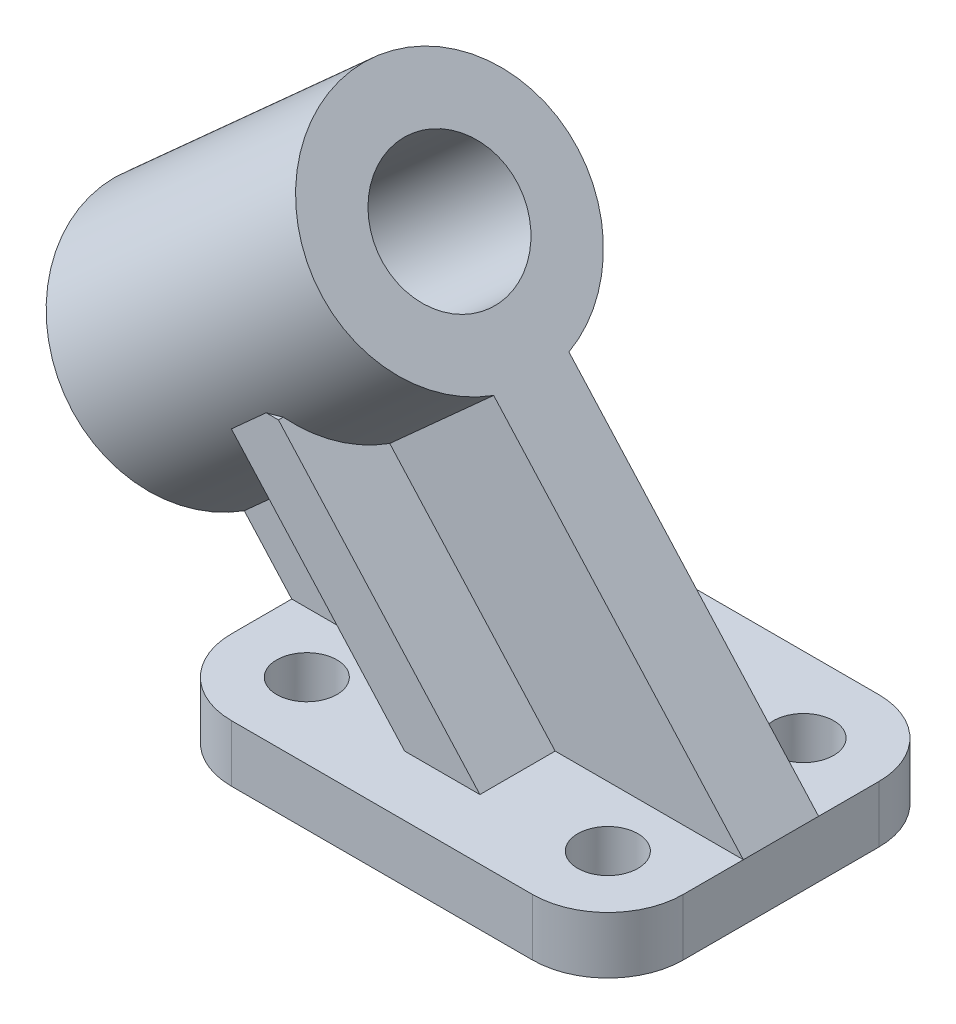
ISO-10303-21;
HEADER;
FILE_DESCRIPTION(('STEP AP214'),'2;1');
FILE_NAME('part.step','',(''),(''),'','','');
FILE_SCHEMA(('AUTOMOTIVE_DESIGN { 1 0 10303 214 1 1 1 1 }'));
ENDSEC;
DATA;
#1=APPLICATION_CONTEXT('core data for automotive mechanical design processes');
#2=APPLICATION_PROTOCOL_DEFINITION('international standard','automotive_design',2000,#1);
#3=PRODUCT_CONTEXT('',#1,'mechanical');
#4=PRODUCT('Part','Part','',(#3));
#5=PRODUCT_RELATED_PRODUCT_CATEGORY('part','',(#4));
#6=PRODUCT_DEFINITION_FORMATION('','',#4);
#7=PRODUCT_DEFINITION_CONTEXT('part definition',#1,'design');
#8=PRODUCT_DEFINITION('design','',#6,#7);
#9=PRODUCT_DEFINITION_SHAPE('','',#8);
#10=(LENGTH_UNIT() NAMED_UNIT(*) SI_UNIT(.MILLI.,.METRE.));
#11=(NAMED_UNIT(*) PLANE_ANGLE_UNIT() SI_UNIT($,.RADIAN.));
#12=(NAMED_UNIT(*) SI_UNIT($,.STERADIAN.) SOLID_ANGLE_UNIT());
#13=UNCERTAINTY_MEASURE_WITH_UNIT(LENGTH_MEASURE(1.E-05),#10,'distance_accuracy_value','');
#14=(GEOMETRIC_REPRESENTATION_CONTEXT(3) GLOBAL_UNCERTAINTY_ASSIGNED_CONTEXT((#13)) GLOBAL_UNIT_ASSIGNED_CONTEXT((#10,
#11,#12)) REPRESENTATION_CONTEXT('',''));
#15=CARTESIAN_POINT('',(0.,0.,0.));
#16=DIRECTION('',(0.,0.,1.));
#17=DIRECTION('',(1.,0.,0.));
#18=AXIS2_PLACEMENT_3D('',#15,#16,#17);
#19=CARTESIAN_POINT('',(17.1756411930332,55.1112688305533,-28.));
#20=DIRECTION('',(-0.743144825477396,-0.669130606358856,0.));
#21=DIRECTION('',(0.669130606358856,-0.743144825477396,0.));
#22=AXIS2_PLACEMENT_3D('',#19,#20,#21);
#23=PLANE('',#22);
#24=DIRECTION('',(0.669130606358856,-0.743144825477396,0.));
#25=VECTOR('',#24,1.);
#26=CARTESIAN_POINT('',(17.1756411930332,55.1112688305533,-28.));
#27=LINE('',#26,#25);
#28=CARTESIAN_POINT('',(26.8294373587605,44.3896419932865,-28.));
#29=VERTEX_POINT('',#28);
#30=CARTESIAN_POINT('',(60.,7.55,-28.));
#31=VERTEX_POINT('',#30);
#32=EDGE_CURVE('E334',#29,#31,#27,.T.);
#33=ORIENTED_EDGE('',*,*,#32,.F.);
#34=CARTESIAN_POINT('',(15.9573518712071,56.4643161980562,-23.));
#35=DIRECTION('',(0.743144825477396,0.669130606358857,0.));
#36=DIRECTION('',(-0.669130606358857,0.743144825477396,0.));
#37=AXIS2_PLACEMENT_3D('',#34,#35,#36);
#38=CIRCLE('',#37,17.);
#39=CARTESIAN_POINT('',(26.8294373587605,44.3896419932865,-18.));
#40=VERTEX_POINT('',#39);
#41=EDGE_CURVE('E293',#29,#40,#38,.T.);
#42=ORIENTED_EDGE('',*,*,#41,.T.);
#43=DIRECTION('',(0.669130606358856,-0.743144825477396,0.));
#44=VECTOR('',#43,1.);
#45=CARTESIAN_POINT('',(17.1756411930332,55.1112688305533,-18.));
#46=LINE('',#45,#44);
#47=CARTESIAN_POINT('',(60.,7.55,-18.));
#48=VERTEX_POINT('',#47);
#49=EDGE_CURVE('E323',#40,#48,#46,.T.);
#50=ORIENTED_EDGE('',*,*,#49,.T.);
#51=DIRECTION('',(0.,0.,-1.));
#52=VECTOR('',#51,1.);
#53=CARTESIAN_POINT('',(60.,7.55,-28.));
#54=LINE('',#53,#52);
#55=EDGE_CURVE('E306',#48,#31,#54,.T.);
#56=ORIENTED_EDGE('',*,*,#55,.T.);
#57=EDGE_LOOP('',(#33,#42,#50,#56));
#58=FACE_BOUND('',#57,.T.);
#59=CARTESIAN_POINT('',(15.957351871207,56.4643161980562,-23.));
#60=DIRECTION('',(0.743144825477396,0.669130606358856,0.));
#61=DIRECTION('',(-0.669130606358856,0.743144825477396,0.));
#62=AXIS2_PLACEMENT_3D('',#59,#60,#61);
#63=CIRCLE('',#62,9.);
#64=CARTESIAN_POINT('',(9.93517641397734,63.1526196273528,-23.));
#65=VERTEX_POINT('',#64);
#66=EDGE_CURVE('E854',#65,#65,#63,.T.);
#67=ORIENTED_EDGE('',*,*,#66,.F.);
#68=EDGE_LOOP('',(#67));
#69=FACE_BOUND('',#68,.T.);
#70=ADVANCED_FACE('F65',(#58,#69),#23,.F.);
#71=CARTESIAN_POINT('',(-17.1785020268227,26.628659337008,-23.));
#72=DIRECTION('',(0.743144825477396,0.669130606358857,0.));
#73=DIRECTION('',(-0.669130606358857,0.743144825477396,0.));
#74=AXIS2_PLACEMENT_3D('',#71,#72,#73);
#75=CYLINDRICAL_SURFACE('',#74,17.);
#76=CARTESIAN_POINT('',(-5.35366211243645,37.2757930190959,-23.));
#77=DIRECTION('',(0.,-1.,0.));
#78=DIRECTION('',(1.,0.,0.));
#79=AXIS2_PLACEMENT_3D('',#76,#77,#78);
#80=ELLIPSE('',#79,25.4061013476984,17.);
#81=CARTESIAN_POINT('',(6.60215028648047,37.2757930190959,-8.));
#82=VERTEX_POINT('',#81);
#83=CARTESIAN_POINT('',(8.23477574564576,37.2757930190959,-8.63589400740324));
#84=VERTEX_POINT('',#83);
#85=EDGE_CURVE('E12',#82,#84,#80,.F.);
#86=ORIENTED_EDGE('',*,*,#85,.T.);
#87=CARTESIAN_POINT('',(2.15074608036136,44.0327925059528,-23.));
#88=DIRECTION('',(-0.743144825477396,-0.669130606358856,0.));
#89=DIRECTION('',(0.669130606358856,-0.743144825477396,0.));
#90=AXIS2_PLACEMENT_3D('',#87,#88,#89);
#91=CIRCLE('',#90,17.);
#92=CARTESIAN_POINT('',(13.0228315679147,31.9581183011831,-18.));
#93=VERTEX_POINT('',#92);
#94=EDGE_CURVE('E234',#84,#93,#91,.F.);
#95=ORIENTED_EDGE('',*,*,#94,.T.);
#96=DIRECTION('',(0.743144825477396,0.669130606358857,0.));
#97=VECTOR('',#96,1.);
#98=CARTESIAN_POINT('',(-6.30641653926925,14.5539851322383,-18.));
#99=LINE('',#98,#97);
#100=EDGE_CURVE('E458',#40,#93,#99,.F.);
#101=ORIENTED_EDGE('',*,*,#100,.F.);
#102=ORIENTED_EDGE('',*,*,#41,.F.);
#103=DIRECTION('',(0.743144825477396,0.669130606358857,0.));
#104=VECTOR('',#103,1.);
#105=CARTESIAN_POINT('',(-6.30641653926925,14.5539851322383,-28.));
#106=LINE('',#105,#104);
#107=CARTESIAN_POINT('',(13.0228315679148,31.9581183011831,-28.));
#108=VERTEX_POINT('',#107);
#109=EDGE_CURVE('E298',#108,#29,#106,.T.);
#110=ORIENTED_EDGE('',*,*,#109,.F.);
#111=CARTESIAN_POINT('',(2.15074608036136,44.0327925059528,-23.));
#112=DIRECTION('',(-0.743144825477396,-0.669130606358856,0.));
#113=DIRECTION('',(0.669130606358856,-0.743144825477396,0.));
#114=AXIS2_PLACEMENT_3D('',#111,#112,#113);
#115=CIRCLE('',#114,17.);
#116=CARTESIAN_POINT('',(8.23477574564576,37.2757930190959,-37.3641059925967));
#117=VERTEX_POINT('',#116);
#118=EDGE_CURVE('E469',#108,#117,#115,.F.);
#119=ORIENTED_EDGE('',*,*,#118,.T.);
#120=CARTESIAN_POINT('',(-5.35366211243645,37.2757930190959,-23.));
#121=DIRECTION('',(0.,1.,0.));
#122=DIRECTION('',(1.,0.,0.));
#123=AXIS2_PLACEMENT_3D('',#120,#121,#122);
#124=ELLIPSE('',#123,25.4061013476984,17.);
#125=CARTESIAN_POINT('',(6.60215028648043,37.2757930190959,-38.));
#126=VERTEX_POINT('',#125);
#127=EDGE_CURVE('E462',#126,#117,#124,.F.);
#128=ORIENTED_EDGE('',*,*,#127,.F.);
#129=DIRECTION('',(0.743144825477396,0.669130606358857,0.));
#130=VECTOR('',#129,1.);
#131=CARTESIAN_POINT('',(-11.8254571759518,20.6835007331889,-38.));
#132=LINE('',#131,#130);
#133=CARTESIAN_POINT('',(1.9811486148939,33.1150244252923,-38.));
#134=VERTEX_POINT('',#133);
#135=EDGE_CURVE('E466',#126,#134,#132,.F.);
#136=ORIENTED_EDGE('',*,*,#135,.T.);
#137=CARTESIAN_POINT('',(-3.37189623597693,39.0601830291114,-23.));
#138=DIRECTION('',(0.743144825477396,0.669130606358856,0.));
#139=DIRECTION('',(-0.669130606358856,0.743144825477396,0.));
#140=AXIS2_PLACEMENT_3D('',#137,#138,#139);
#141=CIRCLE('',#140,17.);
#142=CARTESIAN_POINT('',(7.50018925157645,26.9855088243417,-28.));
#143=VERTEX_POINT('',#142);
#144=EDGE_CURVE('E472',#134,#143,#141,.F.);
#145=ORIENTED_EDGE('',*,*,#144,.T.);
#146=CARTESIAN_POINT('',(-6.30641653926925,14.5539851322383,-28.));
#147=VERTEX_POINT('',#146);
#148=EDGE_CURVE('E302',#147,#143,#106,.T.);
#149=ORIENTED_EDGE('',*,*,#148,.F.);
#150=CARTESIAN_POINT('',(-17.1785020268227,26.628659337008,-23.));
#151=DIRECTION('',(0.743144825477396,0.669130606358857,0.));
#152=DIRECTION('',(-0.669130606358857,0.743144825477396,0.));
#153=AXIS2_PLACEMENT_3D('',#150,#151,#152);
#154=CIRCLE('',#153,17.);
#155=CARTESIAN_POINT('',(-6.30641653926925,14.5539851322383,-18.));
#156=VERTEX_POINT('',#155);
#157=EDGE_CURVE('E294',#147,#156,#154,.T.);
#158=ORIENTED_EDGE('',*,*,#157,.T.);
#159=CARTESIAN_POINT('',(7.50018925157645,26.9855088243417,-18.));
#160=VERTEX_POINT('',#159);
#161=EDGE_CURVE('E457',#160,#156,#99,.F.);
#162=ORIENTED_EDGE('',*,*,#161,.F.);
#163=CARTESIAN_POINT('',(-3.37189623597694,39.0601830291114,-23.));
#164=DIRECTION('',(0.743144825477396,0.669130606358856,0.));
#165=DIRECTION('',(-0.669130606358856,0.743144825477396,0.));
#166=AXIS2_PLACEMENT_3D('',#163,#164,#165);
#167=CIRCLE('',#166,17.);
#168=CARTESIAN_POINT('',(1.98114861489392,33.1150244252923,-8.));
#169=VERTEX_POINT('',#168);
#170=EDGE_CURVE('E81',#160,#169,#167,.F.);
#171=ORIENTED_EDGE('',*,*,#170,.T.);
#172=DIRECTION('',(0.743144825477396,0.669130606358857,0.));
#173=VECTOR('',#172,1.);
#174=CARTESIAN_POINT('',(-11.8254571759518,20.6835007331889,-8.));
#175=LINE('',#174,#173);
#176=EDGE_CURVE('E256',#169,#82,#175,.T.);
#177=ORIENTED_EDGE('',*,*,#176,.T.);
#178=EDGE_LOOP('',(#86,#95,#101,#102,#110,#119,#128,#136,#145,#149,#158,#162,#171,#177));
#179=FACE_BOUND('',#178,.T.);
#180=ADVANCED_FACE('F496',(#179),#75,.T.);
#181=CARTESIAN_POINT('',(0.,7.55,0.));
#182=DIRECTION('',(0.,-1.,0.));
#183=DIRECTION('',(0.,0.,-1.));
#184=AXIS2_PLACEMENT_3D('',#181,#182,#183);
#185=PLANE('',#184);
#186=CARTESIAN_POINT('',(10.,7.55,-10.));
#187=DIRECTION('',(0.,1.,0.));
#188=DIRECTION('',(0.,0.,1.));
#189=AXIS2_PLACEMENT_3D('',#186,#187,#188);
#190=CIRCLE('',#189,3.99999999999999);
#191=CARTESIAN_POINT('',(10.,7.55,-6.00000000000001));
#192=VERTEX_POINT('',#191);
#193=EDGE_CURVE('E345',#192,#192,#190,.T.);
#194=ORIENTED_EDGE('',*,*,#193,.F.);
#195=EDGE_LOOP('',(#194));
#196=FACE_BOUND('',#195,.T.);
#197=CARTESIAN_POINT('',(50.,7.55,-10.));
#198=DIRECTION('',(0.,1.,0.));
#199=DIRECTION('',(0.,0.,1.));
#200=AXIS2_PLACEMENT_3D('',#197,#198,#199);
#201=CIRCLE('',#200,4.);
#202=CARTESIAN_POINT('',(50.,7.55,-6.));
#203=VERTEX_POINT('',#202);
#204=EDGE_CURVE('E337',#203,#203,#201,.T.);
#205=ORIENTED_EDGE('',*,*,#204,.F.);
#206=EDGE_LOOP('',(#205));
#207=FACE_BOUND('',#206,.T.);
#208=DIRECTION('',(0.,0.,-1.));
#209=VECTOR('',#208,1.);
#210=CARTESIAN_POINT('',(35.,7.55,-18.));
#211=LINE('',#210,#209);
#212=CARTESIAN_POINT('',(35.,7.55,-8.));
#213=VERTEX_POINT('',#212);
#214=CARTESIAN_POINT('',(35.,7.55,-18.));
#215=VERTEX_POINT('',#214);
#216=EDGE_CURVE('E244',#213,#215,#211,.T.);
#217=ORIENTED_EDGE('',*,*,#216,.F.);
#218=DIRECTION('',(1.,0.,0.));
#219=VECTOR('',#218,1.);
#220=CARTESIAN_POINT('',(35.,7.55,-8.));
#221=LINE('',#220,#219);
#222=CARTESIAN_POINT('',(25.,7.55,-8.));
#223=VERTEX_POINT('',#222);
#224=EDGE_CURVE('E226',#223,#213,#221,.T.);
#225=ORIENTED_EDGE('',*,*,#224,.F.);
#226=DIRECTION('',(0.,0.,1.));
#227=VECTOR('',#226,1.);
#228=CARTESIAN_POINT('',(25.,7.55,-18.));
#229=LINE('',#228,#227);
#230=CARTESIAN_POINT('',(25.,7.55,-18.));
#231=VERTEX_POINT('',#230);
#232=EDGE_CURVE('E238',#231,#223,#229,.T.);
#233=ORIENTED_EDGE('',*,*,#232,.F.);
#234=DIRECTION('',(1.,0.,0.));
#235=VECTOR('',#234,1.);
#236=CARTESIAN_POINT('',(60.,7.55,-18.));
#237=LINE('',#236,#235);
#238=CARTESIAN_POINT('',(0.,7.55,-18.));
#239=VERTEX_POINT('',#238);
#240=EDGE_CURVE('E320',#239,#231,#237,.T.);
#241=ORIENTED_EDGE('',*,*,#240,.F.);
#242=DIRECTION('',(0.,0.,1.));
#243=VECTOR('',#242,1.);
#244=CARTESIAN_POINT('',(0.,7.55,0.));
#245=LINE('',#244,#243);
#246=CARTESIAN_POINT('',(0.,7.55,-10.));
#247=VERTEX_POINT('',#246);
#248=EDGE_CURVE('E375',#239,#247,#245,.T.);
#249=ORIENTED_EDGE('',*,*,#248,.T.);
#250=CARTESIAN_POINT('',(10.,7.55,-10.));
#251=DIRECTION('',(0.,-1.,0.));
#252=DIRECTION('',(0.,0.,-1.));
#253=AXIS2_PLACEMENT_3D('',#250,#251,#252);
#254=CIRCLE('',#253,10.);
#255=CARTESIAN_POINT('',(10.,7.55,0.));
#256=VERTEX_POINT('',#255);
#257=EDGE_CURVE('E433',#247,#256,#254,.F.);
#258=ORIENTED_EDGE('',*,*,#257,.T.);
#259=DIRECTION('',(1.,0.,0.));
#260=VECTOR('',#259,1.);
#261=CARTESIAN_POINT('',(0.,7.55,0.));
#262=LINE('',#261,#260);
#263=CARTESIAN_POINT('',(50.,7.55,0.));
#264=VERTEX_POINT('',#263);
#265=EDGE_CURVE('E374',#256,#264,#262,.T.);
#266=ORIENTED_EDGE('',*,*,#265,.T.);
#267=CARTESIAN_POINT('',(50.,7.55,-10.));
#268=DIRECTION('',(0.,-1.,0.));
#269=DIRECTION('',(0.,0.,-1.));
#270=AXIS2_PLACEMENT_3D('',#267,#268,#269);
#271=CIRCLE('',#270,10.);
#272=CARTESIAN_POINT('',(60.,7.55,-10.));
#273=VERTEX_POINT('',#272);
#274=EDGE_CURVE('E430',#264,#273,#271,.F.);
#275=ORIENTED_EDGE('',*,*,#274,.T.);
#276=DIRECTION('',(0.,0.,-1.));
#277=VECTOR('',#276,1.);
#278=CARTESIAN_POINT('',(60.,7.55,0.));
#279=LINE('',#278,#277);
#280=EDGE_CURVE('E380',#273,#48,#279,.T.);
#281=ORIENTED_EDGE('',*,*,#280,.T.);
#282=EDGE_CURVE('E319',#215,#48,#237,.T.);
#283=ORIENTED_EDGE('',*,*,#282,.F.);
#284=EDGE_LOOP('',(#217,#225,#233,#241,#249,#258,#266,#275,#281,#283));
#285=FACE_BOUND('',#284,.T.);
#286=ADVANCED_FACE('F484',(#196,#207,#285),#185,.F.);
#287=CARTESIAN_POINT('',(17.1756411930332,55.1112688305533,-18.));
#288=DIRECTION('',(0.,0.,-1.));
#289=DIRECTION('',(-1.,0.,0.));
#290=AXIS2_PLACEMENT_3D('',#287,#288,#289);
#291=PLANE('',#290);
#292=DIRECTION('',(-0.669130606358856,0.743144825477396,0.));
#293=VECTOR('',#292,1.);
#294=CARTESIAN_POINT('',(3.36903540218748,42.67974513845,-18.));
#295=LINE('',#294,#293);
#296=EDGE_CURVE('E74',#215,#93,#295,.T.);
#297=ORIENTED_EDGE('',*,*,#296,.F.);
#298=ORIENTED_EDGE('',*,*,#282,.T.);
#299=ORIENTED_EDGE('',*,*,#49,.F.);
#300=ORIENTED_EDGE('',*,*,#100,.T.);
#301=EDGE_LOOP('',(#297,#298,#299,#300));
#302=FACE_BOUND('',#301,.T.);
#303=ADVANCED_FACE('F481',(#302),#291,.F.);
#304=DIRECTION('',(0.669130606358856,-0.743144825477396,0.));
#305=VECTOR('',#304,1.);
#306=CARTESIAN_POINT('',(-2.15360691415083,37.7071356616086,-18.));
#307=LINE('',#306,#305);
#308=EDGE_CURVE('E475',#160,#231,#307,.T.);
#309=ORIENTED_EDGE('',*,*,#308,.F.);
#310=ORIENTED_EDGE('',*,*,#161,.T.);
#311=DIRECTION('',(0.669130606358856,-0.743144825477396,0.));
#312=VECTOR('',#311,1.);
#313=CARTESIAN_POINT('',(-42.8243588069668,55.1112688305533,-18.));
#314=LINE('',#313,#312);
#315=EDGE_CURVE('E327',#156,#239,#314,.T.);
#316=ORIENTED_EDGE('',*,*,#315,.T.);
#317=ORIENTED_EDGE('',*,*,#240,.T.);
#318=EDGE_LOOP('',(#309,#310,#316,#317));
#319=FACE_BOUND('',#318,.T.);
#320=ADVANCED_FACE('F573',(#319),#291,.F.);
#321=CARTESIAN_POINT('',(10.,7.55,-36.));
#322=DIRECTION('',(0.,1.,0.));
#323=DIRECTION('',(0.,0.,1.));
#324=AXIS2_PLACEMENT_3D('',#321,#322,#323);
#325=CIRCLE('',#324,3.99999999999999);
#326=CARTESIAN_POINT('',(10.,7.55,-32.));
#327=VERTEX_POINT('',#326);
#328=EDGE_CURVE('E353',#327,#327,#325,.T.);
#329=ORIENTED_EDGE('',*,*,#328,.F.);
#330=EDGE_LOOP('',(#329));
#331=FACE_BOUND('',#330,.T.);
#332=CARTESIAN_POINT('',(50.,7.55,-36.));
#333=DIRECTION('',(0.,1.,0.));
#334=DIRECTION('',(0.,0.,1.));
#335=AXIS2_PLACEMENT_3D('',#332,#333,#334);
#336=CIRCLE('',#335,4.);
#337=CARTESIAN_POINT('',(50.,7.55,-32.));
#338=VERTEX_POINT('',#337);
#339=EDGE_CURVE('E361',#338,#338,#336,.T.);
#340=ORIENTED_EDGE('',*,*,#339,.F.);
#341=EDGE_LOOP('',(#340));
#342=FACE_BOUND('',#341,.T.);
#343=DIRECTION('',(0.,0.,-1.));
#344=VECTOR('',#343,1.);
#345=CARTESIAN_POINT('',(35.,7.55,-28.));
#346=LINE('',#345,#344);
#347=CARTESIAN_POINT('',(35.,7.55,-28.));
#348=VERTEX_POINT('',#347);
#349=CARTESIAN_POINT('',(35.,7.55,-38.));
#350=VERTEX_POINT('',#349);
#351=EDGE_CURVE('E259',#348,#350,#346,.T.);
#352=ORIENTED_EDGE('',*,*,#351,.F.);
#353=DIRECTION('',(-1.,0.,0.));
#354=VECTOR('',#353,1.);
#355=CARTESIAN_POINT('',(60.,7.55,-28.));
#356=LINE('',#355,#354);
#357=EDGE_CURVE('E311',#31,#348,#356,.T.);
#358=ORIENTED_EDGE('',*,*,#357,.F.);
#359=CARTESIAN_POINT('',(60.,7.55,-36.));
#360=VERTEX_POINT('',#359);
#361=EDGE_CURVE('E379',#31,#360,#279,.T.);
#362=ORIENTED_EDGE('',*,*,#361,.T.);
#363=CARTESIAN_POINT('',(50.,7.55,-36.));
#364=DIRECTION('',(0.,-1.,0.));
#365=DIRECTION('',(0.,0.,-1.));
#366=AXIS2_PLACEMENT_3D('',#363,#364,#365);
#367=CIRCLE('',#366,10.);
#368=CARTESIAN_POINT('',(50.,7.55,-46.));
#369=VERTEX_POINT('',#368);
#370=EDGE_CURVE('E436',#360,#369,#367,.F.);
#371=ORIENTED_EDGE('',*,*,#370,.T.);
#372=DIRECTION('',(-1.,0.,0.));
#373=VECTOR('',#372,1.);
#374=CARTESIAN_POINT('',(0.,7.55,-46.));
#375=LINE('',#374,#373);
#376=CARTESIAN_POINT('',(10.,7.55,-46.));
#377=VERTEX_POINT('',#376);
#378=EDGE_CURVE('E384',#369,#377,#375,.T.);
#379=ORIENTED_EDGE('',*,*,#378,.T.);
#380=CARTESIAN_POINT('',(10.,7.55,-36.));
#381=DIRECTION('',(0.,-1.,0.));
#382=DIRECTION('',(0.,0.,-1.));
#383=AXIS2_PLACEMENT_3D('',#380,#381,#382);
#384=CIRCLE('',#383,10.);
#385=CARTESIAN_POINT('',(0.,7.55,-36.));
#386=VERTEX_POINT('',#385);
#387=EDGE_CURVE('E439',#377,#386,#384,.F.);
#388=ORIENTED_EDGE('',*,*,#387,.T.);
#389=CARTESIAN_POINT('',(0.,7.55,-28.));
#390=VERTEX_POINT('',#389);
#391=EDGE_CURVE('E370',#386,#390,#245,.T.);
#392=ORIENTED_EDGE('',*,*,#391,.T.);
#393=CARTESIAN_POINT('',(25.,7.55,-28.));
#394=VERTEX_POINT('',#393);
#395=EDGE_CURVE('E310',#394,#390,#356,.T.);
#396=ORIENTED_EDGE('',*,*,#395,.F.);
#397=DIRECTION('',(0.,0.,1.));
#398=VECTOR('',#397,1.);
#399=CARTESIAN_POINT('',(25.,7.55,-28.));
#400=LINE('',#399,#398);
#401=CARTESIAN_POINT('',(25.,7.55,-38.));
#402=VERTEX_POINT('',#401);
#403=EDGE_CURVE('E264',#402,#394,#400,.T.);
#404=ORIENTED_EDGE('',*,*,#403,.F.);
#405=DIRECTION('',(-1.,0.,0.));
#406=VECTOR('',#405,1.);
#407=CARTESIAN_POINT('',(35.,7.55,-38.));
#408=LINE('',#407,#406);
#409=EDGE_CURVE('E272',#350,#402,#408,.T.);
#410=ORIENTED_EDGE('',*,*,#409,.F.);
#411=EDGE_LOOP('',(#352,#358,#362,#371,#379,#388,#392,#396,#404,#410));
#412=FACE_BOUND('',#411,.T.);
#413=ADVANCED_FACE('F536',(#331,#342,#412),#185,.F.);
#414=CARTESIAN_POINT('',(17.1756411930332,55.1112688305533,-28.));
#415=DIRECTION('',(0.,0.,1.));
#416=DIRECTION('',(1.,0.,0.));
#417=AXIS2_PLACEMENT_3D('',#414,#415,#416);
#418=PLANE('',#417);
#419=DIRECTION('',(0.669130606358856,-0.743144825477396,0.));
#420=VECTOR('',#419,1.);
#421=CARTESIAN_POINT('',(8.23477574564576,37.2757930190959,-28.));
#422=LINE('',#421,#420);
#423=EDGE_CURVE('E268',#108,#348,#422,.T.);
#424=ORIENTED_EDGE('',*,*,#423,.F.);
#425=ORIENTED_EDGE('',*,*,#109,.T.);
#426=ORIENTED_EDGE('',*,*,#32,.T.);
#427=ORIENTED_EDGE('',*,*,#357,.T.);
#428=EDGE_LOOP('',(#424,#425,#426,#427));
#429=FACE_BOUND('',#428,.T.);
#430=ADVANCED_FACE('F492',(#429),#418,.F.);
#431=DIRECTION('',(0.669130606358856,-0.743144825477396,0.));
#432=VECTOR('',#431,1.);
#433=CARTESIAN_POINT('',(-1.76522425435425,37.2757930190959,-28.));
#434=LINE('',#433,#432);
#435=EDGE_CURVE('E282',#143,#394,#434,.T.);
#436=ORIENTED_EDGE('',*,*,#435,.T.);
#437=ORIENTED_EDGE('',*,*,#395,.T.);
#438=DIRECTION('',(0.669130606358856,-0.743144825477396,0.));
#439=VECTOR('',#438,1.);
#440=CARTESIAN_POINT('',(-42.8243588069668,55.1112688305533,-28.));
#441=LINE('',#440,#439);
#442=EDGE_CURVE('E330',#147,#390,#441,.T.);
#443=ORIENTED_EDGE('',*,*,#442,.F.);
#444=ORIENTED_EDGE('',*,*,#148,.T.);
#445=EDGE_LOOP('',(#436,#437,#443,#444));
#446=FACE_BOUND('',#445,.T.);
#447=ADVANCED_FACE('F552',(#446),#418,.F.);
#448=CARTESIAN_POINT('',(0.,7.55,0.));
#449=DIRECTION('',(1.,0.,0.));
#450=DIRECTION('',(0.,0.,-1.));
#451=AXIS2_PLACEMENT_3D('',#448,#449,#450);
#452=PLANE('',#451);
#453=ORIENTED_EDGE('',*,*,#391,.F.);
#454=DIRECTION('',(0.,-1.,0.));
#455=VECTOR('',#454,1.);
#456=CARTESIAN_POINT('',(0.,7.55,-36.));
#457=LINE('',#456,#455);
#458=CARTESIAN_POINT('',(0.,0.,-36.));
#459=VERTEX_POINT('',#458);
#460=EDGE_CURVE('E407',#386,#459,#457,.T.);
#461=ORIENTED_EDGE('',*,*,#460,.T.);
#462=DIRECTION('',(0.,0.,1.));
#463=VECTOR('',#462,1.);
#464=CARTESIAN_POINT('',(0.,0.,0.));
#465=LINE('',#464,#463);
#466=CARTESIAN_POINT('',(0.,0.,-10.));
#467=VERTEX_POINT('',#466);
#468=EDGE_CURVE('E369',#459,#467,#465,.T.);
#469=ORIENTED_EDGE('',*,*,#468,.T.);
#470=DIRECTION('',(0.,-1.,0.));
#471=VECTOR('',#470,1.);
#472=CARTESIAN_POINT('',(0.,7.55,-10.));
#473=LINE('',#472,#471);
#474=EDGE_CURVE('E388',#467,#247,#473,.F.);
#475=ORIENTED_EDGE('',*,*,#474,.T.);
#476=ORIENTED_EDGE('',*,*,#248,.F.);
#477=DIRECTION('',(0.,0.,1.));
#478=VECTOR('',#477,1.);
#479=CARTESIAN_POINT('',(0.,7.55,-28.));
#480=LINE('',#479,#478);
#481=EDGE_CURVE('E315',#390,#239,#480,.T.);
#482=ORIENTED_EDGE('',*,*,#481,.F.);
#483=EDGE_LOOP('',(#453,#461,#469,#475,#476,#482));
#484=FACE_BOUND('',#483,.T.);
#485=ADVANCED_FACE('F518',(#484),#452,.F.);
#486=CARTESIAN_POINT('',(0.,7.55,0.));
#487=DIRECTION('',(0.,0.,-1.));
#488=DIRECTION('',(-1.,0.,0.));
#489=AXIS2_PLACEMENT_3D('',#486,#487,#488);
#490=PLANE('',#489);
#491=ORIENTED_EDGE('',*,*,#265,.F.);
#492=DIRECTION('',(0.,-1.,0.));
#493=VECTOR('',#492,1.);
#494=CARTESIAN_POINT('',(10.,7.55,0.));
#495=LINE('',#494,#493);
#496=CARTESIAN_POINT('',(10.,0.,0.));
#497=VERTEX_POINT('',#496);
#498=EDGE_CURVE('E453',#256,#497,#495,.T.);
#499=ORIENTED_EDGE('',*,*,#498,.T.);
#500=DIRECTION('',(1.,0.,0.));
#501=VECTOR('',#500,1.);
#502=CARTESIAN_POINT('',(0.,0.,0.));
#503=LINE('',#502,#501);
#504=CARTESIAN_POINT('',(50.,0.,0.));
#505=VERTEX_POINT('',#504);
#506=EDGE_CURVE('E392',#497,#505,#503,.T.);
#507=ORIENTED_EDGE('',*,*,#506,.T.);
#508=DIRECTION('',(0.,-1.,0.));
#509=VECTOR('',#508,1.);
#510=CARTESIAN_POINT('',(50.,7.55,0.));
#511=LINE('',#510,#509);
#512=EDGE_CURVE('E450',#505,#264,#511,.F.);
#513=ORIENTED_EDGE('',*,*,#512,.T.);
#514=EDGE_LOOP('',(#491,#499,#507,#513));
#515=FACE_BOUND('',#514,.T.);
#516=ADVANCED_FACE('F525',(#515),#490,.F.);
#517=CARTESIAN_POINT('',(60.,7.55,0.));
#518=DIRECTION('',(-1.,0.,0.));
#519=DIRECTION('',(0.,0.,1.));
#520=AXIS2_PLACEMENT_3D('',#517,#518,#519);
#521=PLANE('',#520);
#522=DIRECTION('',(0.,0.,-1.));
#523=VECTOR('',#522,1.);
#524=CARTESIAN_POINT('',(60.,0.,0.));
#525=LINE('',#524,#523);
#526=CARTESIAN_POINT('',(60.,0.,-10.));
#527=VERTEX_POINT('',#526);
#528=CARTESIAN_POINT('',(60.,0.,-36.));
#529=VERTEX_POINT('',#528);
#530=EDGE_CURVE('E396',#527,#529,#525,.T.);
#531=ORIENTED_EDGE('',*,*,#530,.T.);
#532=DIRECTION('',(0.,-1.,0.));
#533=VECTOR('',#532,1.);
#534=CARTESIAN_POINT('',(60.,7.55,-36.));
#535=LINE('',#534,#533);
#536=EDGE_CURVE('E446',#529,#360,#535,.F.);
#537=ORIENTED_EDGE('',*,*,#536,.T.);
#538=ORIENTED_EDGE('',*,*,#361,.F.);
#539=ORIENTED_EDGE('',*,*,#55,.F.);
#540=ORIENTED_EDGE('',*,*,#280,.F.);
#541=DIRECTION('',(0.,-1.,0.));
#542=VECTOR('',#541,1.);
#543=CARTESIAN_POINT('',(60.,7.55,-10.));
#544=LINE('',#543,#542);
#545=EDGE_CURVE('E442',#273,#527,#544,.T.);
#546=ORIENTED_EDGE('',*,*,#545,.T.);
#547=EDGE_LOOP('',(#531,#537,#538,#539,#540,#546));
#548=FACE_BOUND('',#547,.T.);
#549=ADVANCED_FACE('F502',(#548),#521,.F.);
#550=CARTESIAN_POINT('',(0.,7.55,-46.));
#551=DIRECTION('',(0.,0.,1.));
#552=DIRECTION('',(1.,0.,0.));
#553=AXIS2_PLACEMENT_3D('',#550,#551,#552);
#554=PLANE('',#553);
#555=DIRECTION('',(-1.,0.,0.));
#556=VECTOR('',#555,1.);
#557=CARTESIAN_POINT('',(0.,0.,-46.));
#558=LINE('',#557,#556);
#559=CARTESIAN_POINT('',(50.,0.,-46.));
#560=VERTEX_POINT('',#559);
#561=CARTESIAN_POINT('',(10.,0.,-46.));
#562=VERTEX_POINT('',#561);
#563=EDGE_CURVE('E400',#560,#562,#558,.T.);
#564=ORIENTED_EDGE('',*,*,#563,.T.);
#565=DIRECTION('',(0.,-1.,0.));
#566=VECTOR('',#565,1.);
#567=CARTESIAN_POINT('',(10.,7.55,-46.));
#568=LINE('',#567,#566);
#569=EDGE_CURVE('E427',#562,#377,#568,.F.);
#570=ORIENTED_EDGE('',*,*,#569,.T.);
#571=ORIENTED_EDGE('',*,*,#378,.F.);
#572=DIRECTION('',(0.,-1.,0.));
#573=VECTOR('',#572,1.);
#574=CARTESIAN_POINT('',(50.,7.55,-46.));
#575=LINE('',#574,#573);
#576=EDGE_CURVE('E423',#369,#560,#575,.T.);
#577=ORIENTED_EDGE('',*,*,#576,.T.);
#578=EDGE_LOOP('',(#564,#570,#571,#577));
#579=FACE_BOUND('',#578,.T.);
#580=ADVANCED_FACE('F539',(#579),#554,.F.);
#581=CARTESIAN_POINT('',(0.,0.,0.));
#582=DIRECTION('',(0.,-1.,0.));
#583=DIRECTION('',(0.,0.,-1.));
#584=AXIS2_PLACEMENT_3D('',#581,#582,#583);
#585=PLANE('',#584);
#586=CARTESIAN_POINT('',(50.,0.,-10.));
#587=DIRECTION('',(0.,-1.,0.));
#588=DIRECTION('',(0.,0.,-1.));
#589=AXIS2_PLACEMENT_3D('',#586,#587,#588);
#590=CIRCLE('',#589,4.);
#591=CARTESIAN_POINT('',(50.,0.,-14.));
#592=VERTEX_POINT('',#591);
#593=EDGE_CURVE('E341',#592,#592,#590,.T.);
#594=ORIENTED_EDGE('',*,*,#593,.F.);
#595=EDGE_LOOP('',(#594));
#596=FACE_BOUND('',#595,.T.);
#597=CARTESIAN_POINT('',(10.,0.,-10.));
#598=DIRECTION('',(0.,-1.,0.));
#599=DIRECTION('',(0.,0.,-1.));
#600=AXIS2_PLACEMENT_3D('',#597,#598,#599);
#601=CIRCLE('',#600,4.);
#602=CARTESIAN_POINT('',(10.,0.,-14.));
#603=VERTEX_POINT('',#602);
#604=EDGE_CURVE('E349',#603,#603,#601,.T.);
#605=ORIENTED_EDGE('',*,*,#604,.F.);
#606=EDGE_LOOP('',(#605));
#607=FACE_BOUND('',#606,.T.);
#608=CARTESIAN_POINT('',(10.,0.,-36.));
#609=DIRECTION('',(0.,-1.,0.));
#610=DIRECTION('',(0.,0.,-1.));
#611=AXIS2_PLACEMENT_3D('',#608,#609,#610);
#612=CIRCLE('',#611,4.);
#613=CARTESIAN_POINT('',(10.,0.,-40.));
#614=VERTEX_POINT('',#613);
#615=EDGE_CURVE('E357',#614,#614,#612,.T.);
#616=ORIENTED_EDGE('',*,*,#615,.F.);
#617=EDGE_LOOP('',(#616));
#618=FACE_BOUND('',#617,.T.);
#619=CARTESIAN_POINT('',(50.,0.,-36.));
#620=DIRECTION('',(0.,-1.,0.));
#621=DIRECTION('',(0.,0.,-1.));
#622=AXIS2_PLACEMENT_3D('',#619,#620,#621);
#623=CIRCLE('',#622,4.);
#624=CARTESIAN_POINT('',(50.,0.,-40.));
#625=VERTEX_POINT('',#624);
#626=EDGE_CURVE('E365',#625,#625,#623,.T.);
#627=ORIENTED_EDGE('',*,*,#626,.F.);
#628=EDGE_LOOP('',(#627));
#629=FACE_BOUND('',#628,.T.);
#630=ORIENTED_EDGE('',*,*,#468,.F.);
#631=CARTESIAN_POINT('',(10.,0.,-36.));
#632=DIRECTION('',(0.,-1.,0.));
#633=DIRECTION('',(0.,0.,-1.));
#634=AXIS2_PLACEMENT_3D('',#631,#632,#633);
#635=CIRCLE('',#634,10.);
#636=EDGE_CURVE('E420',#459,#562,#635,.T.);
#637=ORIENTED_EDGE('',*,*,#636,.T.);
#638=ORIENTED_EDGE('',*,*,#563,.F.);
#639=CARTESIAN_POINT('',(50.,0.,-36.));
#640=DIRECTION('',(0.,-1.,0.));
#641=DIRECTION('',(0.,0.,-1.));
#642=AXIS2_PLACEMENT_3D('',#639,#640,#641);
#643=CIRCLE('',#642,10.);
#644=EDGE_CURVE('E417',#560,#529,#643,.T.);
#645=ORIENTED_EDGE('',*,*,#644,.T.);
#646=ORIENTED_EDGE('',*,*,#530,.F.);
#647=CARTESIAN_POINT('',(50.,0.,-10.));
#648=DIRECTION('',(0.,-1.,0.));
#649=DIRECTION('',(0.,0.,-1.));
#650=AXIS2_PLACEMENT_3D('',#647,#648,#649);
#651=CIRCLE('',#650,10.);
#652=EDGE_CURVE('E411',#527,#505,#651,.T.);
#653=ORIENTED_EDGE('',*,*,#652,.T.);
#654=ORIENTED_EDGE('',*,*,#506,.F.);
#655=CARTESIAN_POINT('',(10.,0.,-10.));
#656=DIRECTION('',(0.,-1.,0.));
#657=DIRECTION('',(0.,0.,-1.));
#658=AXIS2_PLACEMENT_3D('',#655,#656,#657);
#659=CIRCLE('',#658,10.);
#660=EDGE_CURVE('E414',#497,#467,#659,.T.);
#661=ORIENTED_EDGE('',*,*,#660,.T.);
#662=EDGE_LOOP('',(#630,#637,#638,#645,#646,#653,#654,#661));
#663=FACE_BOUND('',#662,.T.);
#664=ADVANCED_FACE('F528',(#596,#607,#618,#629,#663),#585,.T.);
#665=CARTESIAN_POINT('',(10.,7.55,-36.));
#666=DIRECTION('',(0.,-1.,0.));
#667=DIRECTION('',(0.,0.,-1.));
#668=AXIS2_PLACEMENT_3D('',#665,#666,#667);
#669=CYLINDRICAL_SURFACE('',#668,10.);
#670=ORIENTED_EDGE('',*,*,#387,.F.);
#671=ORIENTED_EDGE('',*,*,#569,.F.);
#672=ORIENTED_EDGE('',*,*,#636,.F.);
#673=ORIENTED_EDGE('',*,*,#460,.F.);
#674=EDGE_LOOP('',(#670,#671,#672,#673));
#675=FACE_BOUND('',#674,.T.);
#676=ADVANCED_FACE('F543',(#675),#669,.T.);
#677=CARTESIAN_POINT('',(50.,7.55,-36.));
#678=DIRECTION('',(0.,-1.,0.));
#679=DIRECTION('',(0.,0.,-1.));
#680=AXIS2_PLACEMENT_3D('',#677,#678,#679);
#681=CYLINDRICAL_SURFACE('',#680,10.);
#682=ORIENTED_EDGE('',*,*,#370,.F.);
#683=ORIENTED_EDGE('',*,*,#536,.F.);
#684=ORIENTED_EDGE('',*,*,#644,.F.);
#685=ORIENTED_EDGE('',*,*,#576,.F.);
#686=EDGE_LOOP('',(#682,#683,#684,#685));
#687=FACE_BOUND('',#686,.T.);
#688=ADVANCED_FACE('F533',(#687),#681,.T.);
#689=CARTESIAN_POINT('',(10.,7.55,-10.));
#690=DIRECTION('',(0.,-1.,0.));
#691=DIRECTION('',(0.,0.,-1.));
#692=AXIS2_PLACEMENT_3D('',#689,#690,#691);
#693=CYLINDRICAL_SURFACE('',#692,10.);
#694=ORIENTED_EDGE('',*,*,#257,.F.);
#695=ORIENTED_EDGE('',*,*,#474,.F.);
#696=ORIENTED_EDGE('',*,*,#660,.F.);
#697=ORIENTED_EDGE('',*,*,#498,.F.);
#698=EDGE_LOOP('',(#694,#695,#696,#697));
#699=FACE_BOUND('',#698,.T.);
#700=ADVANCED_FACE('F522',(#699),#693,.T.);
#701=CARTESIAN_POINT('',(50.,7.55,-10.));
#702=DIRECTION('',(0.,-1.,0.));
#703=DIRECTION('',(0.,0.,-1.));
#704=AXIS2_PLACEMENT_3D('',#701,#702,#703);
#705=CYLINDRICAL_SURFACE('',#704,10.);
#706=ORIENTED_EDGE('',*,*,#274,.F.);
#707=ORIENTED_EDGE('',*,*,#512,.F.);
#708=ORIENTED_EDGE('',*,*,#652,.F.);
#709=ORIENTED_EDGE('',*,*,#545,.F.);
#710=EDGE_LOOP('',(#706,#707,#708,#709));
#711=FACE_BOUND('',#710,.T.);
#712=ADVANCED_FACE('F67',(#711),#705,.T.);
#713=CARTESIAN_POINT('',(50.,7.55,-36.));
#714=DIRECTION('',(0.,1.,0.));
#715=DIRECTION('',(0.,0.,1.));
#716=AXIS2_PLACEMENT_3D('',#713,#714,#715);
#717=CYLINDRICAL_SURFACE('',#716,4.);
#718=ORIENTED_EDGE('',*,*,#339,.T.);
#719=EDGE_LOOP('',(#718));
#720=FACE_BOUND('',#719,.T.);
#721=ORIENTED_EDGE('',*,*,#626,.T.);
#722=EDGE_LOOP('',(#721));
#723=FACE_BOUND('',#722,.T.);
#724=ADVANCED_FACE('F602',(#720,#723),#717,.F.);
#725=CARTESIAN_POINT('',(10.,7.55,-36.));
#726=DIRECTION('',(0.,1.,0.));
#727=DIRECTION('',(0.,0.,1.));
#728=AXIS2_PLACEMENT_3D('',#725,#726,#727);
#729=CYLINDRICAL_SURFACE('',#728,4.);
#730=ORIENTED_EDGE('',*,*,#328,.T.);
#731=EDGE_LOOP('',(#730));
#732=FACE_BOUND('',#731,.T.);
#733=ORIENTED_EDGE('',*,*,#615,.T.);
#734=EDGE_LOOP('',(#733));
#735=FACE_BOUND('',#734,.T.);
#736=ADVANCED_FACE('F598',(#732,#735),#729,.F.);
#737=CARTESIAN_POINT('',(10.,7.55,-10.));
#738=DIRECTION('',(0.,1.,0.));
#739=DIRECTION('',(0.,0.,1.));
#740=AXIS2_PLACEMENT_3D('',#737,#738,#739);
#741=CYLINDRICAL_SURFACE('',#740,4.);
#742=ORIENTED_EDGE('',*,*,#193,.T.);
#743=EDGE_LOOP('',(#742));
#744=FACE_BOUND('',#743,.T.);
#745=ORIENTED_EDGE('',*,*,#604,.T.);
#746=EDGE_LOOP('',(#745));
#747=FACE_BOUND('',#746,.T.);
#748=ADVANCED_FACE('F594',(#744,#747),#741,.F.);
#749=CARTESIAN_POINT('',(50.,7.55,-10.));
#750=DIRECTION('',(0.,1.,0.));
#751=DIRECTION('',(0.,0.,1.));
#752=AXIS2_PLACEMENT_3D('',#749,#750,#751);
#753=CYLINDRICAL_SURFACE('',#752,4.);
#754=ORIENTED_EDGE('',*,*,#204,.T.);
#755=EDGE_LOOP('',(#754));
#756=FACE_BOUND('',#755,.T.);
#757=ORIENTED_EDGE('',*,*,#593,.T.);
#758=EDGE_LOOP('',(#757));
#759=FACE_BOUND('',#758,.T.);
#760=ADVANCED_FACE('F591',(#756,#759),#753,.F.);
#761=CARTESIAN_POINT('',(-42.8243588069668,55.1112688305533,-28.));
#762=DIRECTION('',(0.743144825477396,0.669130606358856,0.));
#763=DIRECTION('',(-0.669130606358856,0.743144825477396,0.));
#764=AXIS2_PLACEMENT_3D('',#761,#762,#763);
#765=PLANE('',#764);
#766=CARTESIAN_POINT('',(-17.1785020268227,26.628659337008,-23.));
#767=DIRECTION('',(0.743144825477396,0.669130606358856,0.));
#768=DIRECTION('',(-0.669130606358856,0.743144825477396,0.));
#769=AXIS2_PLACEMENT_3D('',#766,#767,#768);
#770=CIRCLE('',#769,8.99999999999999);
#771=CARTESIAN_POINT('',(-23.2006774840524,33.3169627663046,-23.));
#772=VERTEX_POINT('',#771);
#773=EDGE_CURVE('E241',#772,#772,#770,.T.);
#774=ORIENTED_EDGE('',*,*,#773,.T.);
#775=EDGE_LOOP('',(#774));
#776=FACE_BOUND('',#775,.T.);
#777=ORIENTED_EDGE('',*,*,#157,.F.);
#778=ORIENTED_EDGE('',*,*,#442,.T.);
#779=ORIENTED_EDGE('',*,*,#481,.T.);
#780=ORIENTED_EDGE('',*,*,#315,.F.);
#781=EDGE_LOOP('',(#777,#778,#779,#780));
#782=FACE_BOUND('',#781,.T.);
#783=ADVANCED_FACE('F549',(#776,#782),#765,.F.);
#784=CARTESIAN_POINT('',(8.23477574564576,37.2757930190959,-28.));
#785=DIRECTION('',(-0.743144825477396,-0.669130606358856,0.));
#786=DIRECTION('',(0.669130606358856,-0.743144825477396,0.));
#787=AXIS2_PLACEMENT_3D('',#784,#785,#786);
#788=PLANE('',#787);
#789=ORIENTED_EDGE('',*,*,#118,.F.);
#790=ORIENTED_EDGE('',*,*,#423,.T.);
#791=ORIENTED_EDGE('',*,*,#351,.T.);
#792=DIRECTION('',(0.669130606358856,-0.743144825477396,0.));
#793=VECTOR('',#792,1.);
#794=CARTESIAN_POINT('',(8.23477574564576,37.2757930190959,-38.));
#795=LINE('',#794,#793);
#796=CARTESIAN_POINT('',(8.23477574564576,37.2757930190959,-38.));
#797=VERTEX_POINT('',#796);
#798=EDGE_CURVE('E289',#797,#350,#795,.T.);
#799=ORIENTED_EDGE('',*,*,#798,.F.);
#800=DIRECTION('',(0.,0.,-1.));
#801=VECTOR('',#800,1.);
#802=CARTESIAN_POINT('',(8.23477574564576,37.2757930190959,-28.));
#803=LINE('',#802,#801);
#804=EDGE_CURVE('E260',#117,#797,#803,.T.);
#805=ORIENTED_EDGE('',*,*,#804,.F.);
#806=EDGE_LOOP('',(#789,#790,#791,#799,#805));
#807=FACE_BOUND('',#806,.T.);
#808=ADVANCED_FACE('F564',(#807),#788,.F.);
#809=CARTESIAN_POINT('',(8.23477574564576,37.2757930190959,-38.));
#810=DIRECTION('',(0.,0.,1.));
#811=DIRECTION('',(1.,0.,0.));
#812=AXIS2_PLACEMENT_3D('',#809,#810,#811);
#813=PLANE('',#812);
#814=ORIENTED_EDGE('',*,*,#135,.F.);
#815=DIRECTION('',(-1.,0.,0.));
#816=VECTOR('',#815,1.);
#817=CARTESIAN_POINT('',(8.23477574564576,37.2757930190959,-38.));
#818=LINE('',#817,#816);
#819=EDGE_CURVE('E263',#797,#126,#818,.T.);
#820=ORIENTED_EDGE('',*,*,#819,.F.);
#821=ORIENTED_EDGE('',*,*,#798,.T.);
#822=ORIENTED_EDGE('',*,*,#409,.T.);
#823=DIRECTION('',(0.669130606358856,-0.743144825477396,0.));
#824=VECTOR('',#823,1.);
#825=CARTESIAN_POINT('',(-1.76522425435425,37.2757930190959,-38.));
#826=LINE('',#825,#824);
#827=EDGE_CURVE('E285',#134,#402,#826,.T.);
#828=ORIENTED_EDGE('',*,*,#827,.F.);
#829=EDGE_LOOP('',(#814,#820,#821,#822,#828));
#830=FACE_BOUND('',#829,.T.);
#831=ADVANCED_FACE('F560',(#830),#813,.F.);
#832=CARTESIAN_POINT('',(-1.76522425435425,37.2757930190959,-28.));
#833=DIRECTION('',(0.743144825477396,0.669130606358856,0.));
#834=DIRECTION('',(-0.669130606358856,0.743144825477396,0.));
#835=AXIS2_PLACEMENT_3D('',#832,#833,#834);
#836=PLANE('',#835);
#837=ORIENTED_EDGE('',*,*,#144,.F.);
#838=ORIENTED_EDGE('',*,*,#827,.T.);
#839=ORIENTED_EDGE('',*,*,#403,.T.);
#840=ORIENTED_EDGE('',*,*,#435,.F.);
#841=EDGE_LOOP('',(#837,#838,#839,#840));
#842=FACE_BOUND('',#841,.T.);
#843=ADVANCED_FACE('F556',(#842),#836,.F.);
#844=CARTESIAN_POINT('',(-26.7652242543542,37.2757930190959,0.));
#845=DIRECTION('',(0.,1.,0.));
#846=DIRECTION('',(0.,0.,1.));
#847=AXIS2_PLACEMENT_3D('',#844,#845,#846);
#848=PLANE('',#847);
#849=ORIENTED_EDGE('',*,*,#819,.T.);
#850=ORIENTED_EDGE('',*,*,#127,.T.);
#851=ORIENTED_EDGE('',*,*,#804,.T.);
#852=EDGE_LOOP('',(#849,#850,#851));
#853=FACE_BOUND('',#852,.T.);
#854=ADVANCED_FACE('F567',(#853),#848,.T.);
#855=CARTESIAN_POINT('',(8.23477574564576,37.2757930190959,-18.));
#856=DIRECTION('',(-0.743144825477396,-0.669130606358856,0.));
#857=DIRECTION('',(0.669130606358856,-0.743144825477396,0.));
#858=AXIS2_PLACEMENT_3D('',#855,#856,#857);
#859=PLANE('',#858);
#860=ORIENTED_EDGE('',*,*,#94,.F.);
#861=DIRECTION('',(0.,0.,-1.));
#862=VECTOR('',#861,1.);
#863=CARTESIAN_POINT('',(8.23477574564576,37.2757930190959,-18.));
#864=LINE('',#863,#862);
#865=CARTESIAN_POINT('',(8.23477574564576,37.2757930190959,-8.));
#866=VERTEX_POINT('',#865);
#867=EDGE_CURVE('E217',#866,#84,#864,.T.);
#868=ORIENTED_EDGE('',*,*,#867,.F.);
#869=DIRECTION('',(0.669130606358856,-0.743144825477396,0.));
#870=VECTOR('',#869,1.);
#871=CARTESIAN_POINT('',(8.23477574564576,37.2757930190959,-8.));
#872=LINE('',#871,#870);
#873=EDGE_CURVE('E220',#866,#213,#872,.T.);
#874=ORIENTED_EDGE('',*,*,#873,.T.);
#875=ORIENTED_EDGE('',*,*,#216,.T.);
#876=ORIENTED_EDGE('',*,*,#296,.T.);
#877=EDGE_LOOP('',(#860,#868,#874,#875,#876));
#878=FACE_BOUND('',#877,.T.);
#879=ADVANCED_FACE('F232',(#878),#859,.F.);
#880=CARTESIAN_POINT('',(-1.76522425435425,37.2757930190959,-18.));
#881=DIRECTION('',(0.743144825477396,0.669130606358856,0.));
#882=DIRECTION('',(-0.669130606358856,0.743144825477396,0.));
#883=AXIS2_PLACEMENT_3D('',#880,#881,#882);
#884=PLANE('',#883);
#885=ORIENTED_EDGE('',*,*,#170,.F.);
#886=ORIENTED_EDGE('',*,*,#308,.T.);
#887=ORIENTED_EDGE('',*,*,#232,.T.);
#888=DIRECTION('',(0.669130606358856,-0.743144825477396,0.));
#889=VECTOR('',#888,1.);
#890=CARTESIAN_POINT('',(-1.76522425435425,37.2757930190959,-8.));
#891=LINE('',#890,#889);
#892=EDGE_CURVE('E230',#169,#223,#891,.T.);
#893=ORIENTED_EDGE('',*,*,#892,.F.);
#894=EDGE_LOOP('',(#885,#886,#887,#893));
#895=FACE_BOUND('',#894,.T.);
#896=ADVANCED_FACE('F572',(#895),#884,.F.);
#897=CARTESIAN_POINT('',(8.23477574564576,37.2757930190959,-8.));
#898=DIRECTION('',(0.,0.,-1.));
#899=DIRECTION('',(-1.,0.,0.));
#900=AXIS2_PLACEMENT_3D('',#897,#898,#899);
#901=PLANE('',#900);
#902=ORIENTED_EDGE('',*,*,#176,.F.);
#903=ORIENTED_EDGE('',*,*,#892,.T.);
#904=ORIENTED_EDGE('',*,*,#224,.T.);
#905=ORIENTED_EDGE('',*,*,#873,.F.);
#906=DIRECTION('',(1.,0.,0.));
#907=VECTOR('',#906,1.);
#908=CARTESIAN_POINT('',(8.23477574564576,37.2757930190959,-8.));
#909=LINE('',#908,#907);
#910=EDGE_CURVE('E213',#82,#866,#909,.T.);
#911=ORIENTED_EDGE('',*,*,#910,.F.);
#912=EDGE_LOOP('',(#902,#903,#904,#905,#911));
#913=FACE_BOUND('',#912,.T.);
#914=ADVANCED_FACE('F224',(#913),#901,.F.);
#915=CARTESIAN_POINT('',(-26.7652242543542,37.2757930190959,0.));
#916=DIRECTION('',(0.,-1.,0.));
#917=DIRECTION('',(0.,0.,-1.));
#918=AXIS2_PLACEMENT_3D('',#915,#916,#917);
#919=PLANE('',#918);
#920=ORIENTED_EDGE('',*,*,#85,.F.);
#921=ORIENTED_EDGE('',*,*,#910,.T.);
#922=ORIENTED_EDGE('',*,*,#867,.T.);
#923=EDGE_LOOP('',(#920,#921,#922));
#924=FACE_BOUND('',#923,.T.);
#925=ADVANCED_FACE('F215',(#924),#919,.F.);
#926=CARTESIAN_POINT('',(15.957351871207,56.4643161980562,-23.));
#927=DIRECTION('',(0.743144825477396,0.669130606358856,0.));
#928=DIRECTION('',(-0.669130606358856,0.743144825477396,0.));
#929=AXIS2_PLACEMENT_3D('',#926,#927,#928);
#930=CYLINDRICAL_SURFACE('',#929,8.99999999999999);
#931=ORIENTED_EDGE('',*,*,#773,.F.);
#932=EDGE_LOOP('',(#931));
#933=FACE_BOUND('',#932,.T.);
#934=ORIENTED_EDGE('',*,*,#66,.T.);
#935=EDGE_LOOP('',(#934));
#936=FACE_BOUND('',#935,.T.);
#937=ADVANCED_FACE('F703',(#933,#936),#930,.F.);
#938=CLOSED_SHELL('',(#70,#180,#286,#303,#320,#413,#430,#447,#485,#516,#549,#580,#664,#676,#688,
#700,#712,#724,#736,#748,#760,#783,#808,#831,#843,#854,#879,#896,#914,#925,#937));
#939=MANIFOLD_SOLID_BREP('B2',#938);
#940=ADVANCED_BREP_SHAPE_REPRESENTATION('',(#18,#939),#14);
#941=SHAPE_DEFINITION_REPRESENTATION(#9,#940);
ENDSEC;
END-ISO-10303-21;
